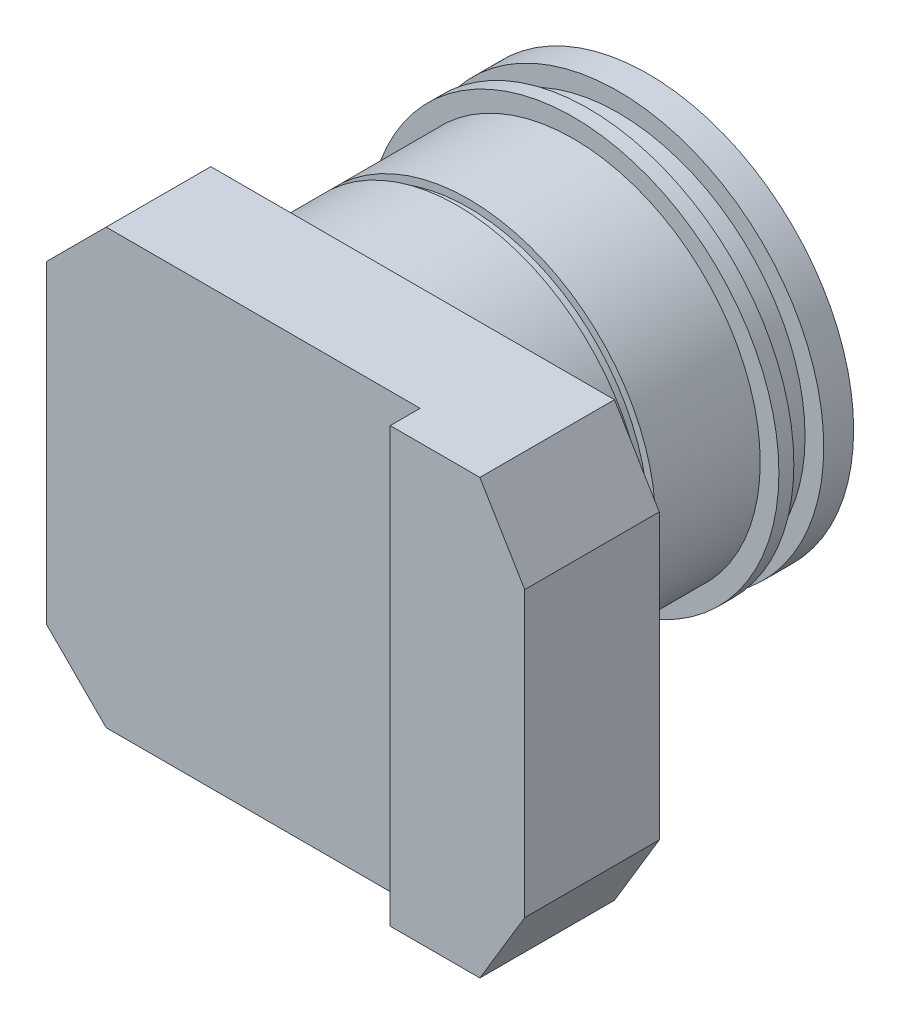
ISO-10303-21;
HEADER;
FILE_DESCRIPTION(('STEP AP214'),'2;1');
FILE_NAME('part.step','',(''),(''),'','','');
FILE_SCHEMA(('AUTOMOTIVE_DESIGN { 1 0 10303 214 1 1 1 1 }'));
ENDSEC;
DATA;
#1=APPLICATION_CONTEXT('core data for automotive mechanical design processes');
#2=APPLICATION_PROTOCOL_DEFINITION('international standard','automotive_design',2000,#1);
#3=PRODUCT_CONTEXT('',#1,'mechanical');
#4=PRODUCT('Part','Part','',(#3));
#5=PRODUCT_RELATED_PRODUCT_CATEGORY('part','',(#4));
#6=PRODUCT_DEFINITION_FORMATION('','',#4);
#7=PRODUCT_DEFINITION_CONTEXT('part definition',#1,'design');
#8=PRODUCT_DEFINITION('design','',#6,#7);
#9=PRODUCT_DEFINITION_SHAPE('','',#8);
#10=(LENGTH_UNIT() NAMED_UNIT(*) SI_UNIT(.MILLI.,.METRE.));
#11=(NAMED_UNIT(*) PLANE_ANGLE_UNIT() SI_UNIT($,.RADIAN.));
#12=(NAMED_UNIT(*) SI_UNIT($,.STERADIAN.) SOLID_ANGLE_UNIT());
#13=UNCERTAINTY_MEASURE_WITH_UNIT(LENGTH_MEASURE(1.E-05),#10,'distance_accuracy_value','');
#14=(GEOMETRIC_REPRESENTATION_CONTEXT(3) GLOBAL_UNCERTAINTY_ASSIGNED_CONTEXT((#13)) GLOBAL_UNIT_ASSIGNED_CONTEXT((#10,
#11,#12)) REPRESENTATION_CONTEXT('',''));
#15=CARTESIAN_POINT('',(0.,0.,0.));
#16=DIRECTION('',(0.,0.,1.));
#17=DIRECTION('',(1.,0.,0.));
#18=AXIS2_PLACEMENT_3D('',#15,#16,#17);
#19=CARTESIAN_POINT('',(0.,0.,3.5));
#20=DIRECTION('',(0.,0.,-1.));
#21=DIRECTION('',(-1.,0.,0.));
#22=AXIS2_PLACEMENT_3D('',#19,#20,#21);
#23=PLANE('',#22);
#24=DIRECTION('',(1.,0.,0.));
#25=VECTOR('',#24,1.);
#26=CARTESIAN_POINT('',(-17.,14.5,3.5));
#27=LINE('',#26,#25);
#28=CARTESIAN_POINT('',(-13.,14.5,3.5));
#29=VERTEX_POINT('',#28);
#30=CARTESIAN_POINT('',(8.,14.5,3.5));
#31=VERTEX_POINT('',#30);
#32=EDGE_CURVE('E148',#29,#31,#27,.T.);
#33=ORIENTED_EDGE('',*,*,#32,.F.);
#34=DIRECTION('',(-0.707106781186548,-0.707106781186548,0.));
#35=VECTOR('',#34,1.);
#36=CARTESIAN_POINT('',(-13.75,13.75,3.5));
#37=LINE('',#36,#35);
#38=CARTESIAN_POINT('',(-17.,10.5,3.5));
#39=VERTEX_POINT('',#38);
#40=EDGE_CURVE('E159',#29,#39,#37,.T.);
#41=ORIENTED_EDGE('',*,*,#40,.T.);
#42=DIRECTION('',(0.,-1.,0.));
#43=VECTOR('',#42,1.);
#44=CARTESIAN_POINT('',(-17.,14.5,3.5));
#45=LINE('',#44,#43);
#46=CARTESIAN_POINT('',(-17.,-10.5,3.5));
#47=VERTEX_POINT('',#46);
#48=EDGE_CURVE('E11',#39,#47,#45,.T.);
#49=ORIENTED_EDGE('',*,*,#48,.T.);
#50=DIRECTION('',(0.707106781186548,-0.707106781186547,0.));
#51=VECTOR('',#50,1.);
#52=CARTESIAN_POINT('',(-13.75,-13.75,3.5));
#53=LINE('',#52,#51);
#54=CARTESIAN_POINT('',(-13.,-14.5,3.5));
#55=VERTEX_POINT('',#54);
#56=EDGE_CURVE('E170',#47,#55,#53,.T.);
#57=ORIENTED_EDGE('',*,*,#56,.T.);
#58=DIRECTION('',(1.,0.,0.));
#59=VECTOR('',#58,1.);
#60=CARTESIAN_POINT('',(-17.,-14.5,3.5));
#61=LINE('',#60,#59);
#62=CARTESIAN_POINT('',(8.00000000000001,-14.5,3.5));
#63=VERTEX_POINT('',#62);
#64=EDGE_CURVE('E45',#55,#63,#61,.T.);
#65=ORIENTED_EDGE('',*,*,#64,.T.);
#66=DIRECTION('',(0.,-1.,0.));
#67=VECTOR('',#66,1.);
#68=CARTESIAN_POINT('',(8.,14.5,3.5));
#69=LINE('',#68,#67);
#70=EDGE_CURVE('E155',#31,#63,#69,.T.);
#71=ORIENTED_EDGE('',*,*,#70,.F.);
#72=EDGE_LOOP('',(#33,#41,#49,#57,#65,#71));
#73=FACE_BOUND('',#72,.T.);
#74=ADVANCED_FACE('F36',(#73),#23,.F.);
#75=CARTESIAN_POINT('',(-17.,14.5,3.5));
#76=DIRECTION('',(0.,1.,0.));
#77=DIRECTION('',(0.,0.,1.));
#78=AXIS2_PLACEMENT_3D('',#75,#76,#77);
#79=PLANE('',#78);
#80=DIRECTION('',(0.,0.,-1.));
#81=VECTOR('',#80,1.);
#82=CARTESIAN_POINT('',(14.,14.5,5.5));
#83=LINE('',#82,#81);
#84=CARTESIAN_POINT('',(14.,14.5,5.5));
#85=VERTEX_POINT('',#84);
#86=CARTESIAN_POINT('',(14.,14.5,-3.5));
#87=VERTEX_POINT('',#86);
#88=EDGE_CURVE('E183',#85,#87,#83,.T.);
#89=ORIENTED_EDGE('',*,*,#88,.T.);
#90=DIRECTION('',(1.,0.,0.));
#91=VECTOR('',#90,1.);
#92=CARTESIAN_POINT('',(-17.,14.5,-3.5));
#93=LINE('',#92,#91);
#94=CARTESIAN_POINT('',(-13.,14.5,-3.5));
#95=VERTEX_POINT('',#94);
#96=EDGE_CURVE('E141',#95,#87,#93,.T.);
#97=ORIENTED_EDGE('',*,*,#96,.F.);
#98=DIRECTION('',(0.,0.,-1.));
#99=VECTOR('',#98,1.);
#100=CARTESIAN_POINT('',(-13.,14.5,5.5));
#101=LINE('',#100,#99);
#102=EDGE_CURVE('E193',#29,#95,#101,.T.);
#103=ORIENTED_EDGE('',*,*,#102,.F.);
#104=ORIENTED_EDGE('',*,*,#32,.T.);
#105=DIRECTION('',(0.,0.,-1.));
#106=VECTOR('',#105,1.);
#107=CARTESIAN_POINT('',(8.,14.5,5.5));
#108=LINE('',#107,#106);
#109=CARTESIAN_POINT('',(8.,14.5,5.5));
#110=VERTEX_POINT('',#109);
#111=EDGE_CURVE('E145',#110,#31,#108,.T.);
#112=ORIENTED_EDGE('',*,*,#111,.F.);
#113=DIRECTION('',(-1.,0.,0.));
#114=VECTOR('',#113,1.);
#115=CARTESIAN_POINT('',(17.,14.5,5.5));
#116=LINE('',#115,#114);
#117=EDGE_CURVE('E164',#85,#110,#116,.T.);
#118=ORIENTED_EDGE('',*,*,#117,.F.);
#119=EDGE_LOOP('',(#89,#97,#103,#104,#112,#118));
#120=FACE_BOUND('',#119,.T.);
#121=ADVANCED_FACE('F38',(#120),#79,.T.);
#122=CARTESIAN_POINT('',(-17.,14.5,3.5));
#123=DIRECTION('',(1.,0.,0.));
#124=DIRECTION('',(0.,1.,0.));
#125=AXIS2_PLACEMENT_3D('',#122,#123,#124);
#126=PLANE('',#125);
#127=ORIENTED_EDGE('',*,*,#48,.F.);
#128=DIRECTION('',(0.,0.,-1.));
#129=VECTOR('',#128,1.);
#130=CARTESIAN_POINT('',(-17.,10.5,5.5));
#131=LINE('',#130,#129);
#132=CARTESIAN_POINT('',(-17.,10.5,-3.5));
#133=VERTEX_POINT('',#132);
#134=EDGE_CURVE('E126',#39,#133,#131,.T.);
#135=ORIENTED_EDGE('',*,*,#134,.T.);
#136=DIRECTION('',(0.,-1.,0.));
#137=VECTOR('',#136,1.);
#138=CARTESIAN_POINT('',(-17.,14.5,-3.5));
#139=LINE('',#138,#137);
#140=CARTESIAN_POINT('',(-17.,0.,-3.5));
#141=VERTEX_POINT('',#140);
#142=EDGE_CURVE('E40',#133,#141,#139,.T.);
#143=ORIENTED_EDGE('',*,*,#142,.T.);
#144=CARTESIAN_POINT('',(-17.,-10.5,-3.5));
#145=VERTEX_POINT('',#144);
#146=EDGE_CURVE('E58',#141,#145,#139,.T.);
#147=ORIENTED_EDGE('',*,*,#146,.T.);
#148=DIRECTION('',(0.,0.,-1.));
#149=VECTOR('',#148,1.);
#150=CARTESIAN_POINT('',(-17.,-10.5,5.5));
#151=LINE('',#150,#149);
#152=EDGE_CURVE('E123',#47,#145,#151,.T.);
#153=ORIENTED_EDGE('',*,*,#152,.F.);
#154=EDGE_LOOP('',(#127,#135,#143,#147,#153));
#155=FACE_BOUND('',#154,.T.);
#156=ADVANCED_FACE('F265',(#155),#126,.F.);
#157=CARTESIAN_POINT('',(-17.,-14.5,3.5));
#158=DIRECTION('',(0.,1.,0.));
#159=DIRECTION('',(0.,0.,1.));
#160=AXIS2_PLACEMENT_3D('',#157,#158,#159);
#161=PLANE('',#160);
#162=ORIENTED_EDGE('',*,*,#64,.F.);
#163=DIRECTION('',(0.,0.,-1.));
#164=VECTOR('',#163,1.);
#165=CARTESIAN_POINT('',(-13.,-14.5,5.5));
#166=LINE('',#165,#164);
#167=CARTESIAN_POINT('',(-13.,-14.5,-3.5));
#168=VERTEX_POINT('',#167);
#169=EDGE_CURVE('E121',#55,#168,#166,.T.);
#170=ORIENTED_EDGE('',*,*,#169,.T.);
#171=DIRECTION('',(1.,0.,0.));
#172=VECTOR('',#171,1.);
#173=CARTESIAN_POINT('',(-17.,-14.5,-3.5));
#174=LINE('',#173,#172);
#175=CARTESIAN_POINT('',(14.,-14.5,-3.5));
#176=VERTEX_POINT('',#175);
#177=EDGE_CURVE('E133',#168,#176,#174,.T.);
#178=ORIENTED_EDGE('',*,*,#177,.T.);
#179=DIRECTION('',(0.,0.,-1.));
#180=VECTOR('',#179,1.);
#181=CARTESIAN_POINT('',(14.,-14.5,5.5));
#182=LINE('',#181,#180);
#183=CARTESIAN_POINT('',(14.,-14.5,5.5));
#184=VERTEX_POINT('',#183);
#185=EDGE_CURVE('E173',#184,#176,#182,.T.);
#186=ORIENTED_EDGE('',*,*,#185,.F.);
#187=DIRECTION('',(1.,0.,0.));
#188=VECTOR('',#187,1.);
#189=CARTESIAN_POINT('',(17.,-14.5,5.5));
#190=LINE('',#189,#188);
#191=CARTESIAN_POINT('',(8.00000000000001,-14.5,5.5));
#192=VERTEX_POINT('',#191);
#193=EDGE_CURVE('E154',#192,#184,#190,.T.);
#194=ORIENTED_EDGE('',*,*,#193,.F.);
#195=DIRECTION('',(0.,0.,-1.));
#196=VECTOR('',#195,1.);
#197=CARTESIAN_POINT('',(8.00000000000001,-14.5,5.5));
#198=LINE('',#197,#196);
#199=EDGE_CURVE('E152',#192,#63,#198,.T.);
#200=ORIENTED_EDGE('',*,*,#199,.T.);
#201=EDGE_LOOP('',(#162,#170,#178,#186,#194,#200));
#202=FACE_BOUND('',#201,.T.);
#203=ADVANCED_FACE('F131',(#202),#161,.F.);
#204=CARTESIAN_POINT('',(17.,14.5,3.5));
#205=DIRECTION('',(1.,0.,0.));
#206=DIRECTION('',(0.,1.,0.));
#207=AXIS2_PLACEMENT_3D('',#204,#205,#206);
#208=PLANE('',#207);
#209=DIRECTION('',(0.,0.,-1.));
#210=VECTOR('',#209,1.);
#211=CARTESIAN_POINT('',(17.,9.5,5.5));
#212=LINE('',#211,#210);
#213=CARTESIAN_POINT('',(17.,9.5,5.5));
#214=VERTEX_POINT('',#213);
#215=CARTESIAN_POINT('',(17.,9.5,-3.5));
#216=VERTEX_POINT('',#215);
#217=EDGE_CURVE('E181',#214,#216,#212,.T.);
#218=ORIENTED_EDGE('',*,*,#217,.F.);
#219=DIRECTION('',(0.,1.,0.));
#220=VECTOR('',#219,1.);
#221=CARTESIAN_POINT('',(17.,14.5,5.5));
#222=LINE('',#221,#220);
#223=CARTESIAN_POINT('',(17.,-9.49999999999998,5.5));
#224=VERTEX_POINT('',#223);
#225=EDGE_CURVE('E158',#224,#214,#222,.T.);
#226=ORIENTED_EDGE('',*,*,#225,.F.);
#227=DIRECTION('',(0.,0.,-1.));
#228=VECTOR('',#227,1.);
#229=CARTESIAN_POINT('',(17.,-9.5,5.5));
#230=LINE('',#229,#228);
#231=CARTESIAN_POINT('',(17.,-9.5,-3.5));
#232=VERTEX_POINT('',#231);
#233=EDGE_CURVE('E172',#224,#232,#230,.T.);
#234=ORIENTED_EDGE('',*,*,#233,.T.);
#235=DIRECTION('',(0.,-1.,0.));
#236=VECTOR('',#235,1.);
#237=CARTESIAN_POINT('',(17.,14.5,-3.5));
#238=LINE('',#237,#236);
#239=EDGE_CURVE('E140',#216,#232,#238,.T.);
#240=ORIENTED_EDGE('',*,*,#239,.F.);
#241=EDGE_LOOP('',(#218,#226,#234,#240));
#242=FACE_BOUND('',#241,.T.);
#243=ADVANCED_FACE('F274',(#242),#208,.T.);
#244=CARTESIAN_POINT('',(0.,0.,-3.5));
#245=DIRECTION('',(0.,0.,-1.));
#246=DIRECTION('',(-1.,0.,0.));
#247=AXIS2_PLACEMENT_3D('',#244,#245,#246);
#248=PLANE('',#247);
#249=ORIENTED_EDGE('',*,*,#146,.F.);
#250=CARTESIAN_POINT('',(-4.5,0.,-3.5));
#251=DIRECTION('',(0.,0.,1.));
#252=DIRECTION('',(1.,0.,0.));
#253=AXIS2_PLACEMENT_3D('',#250,#251,#252);
#254=CIRCLE('',#253,12.5);
#255=EDGE_CURVE('E51',#141,#141,#254,.T.);
#256=ORIENTED_EDGE('',*,*,#255,.T.);
#257=ORIENTED_EDGE('',*,*,#142,.F.);
#258=DIRECTION('',(-0.707106781186548,-0.707106781186548,0.));
#259=VECTOR('',#258,1.);
#260=CARTESIAN_POINT('',(-17.,10.5,-3.5));
#261=LINE('',#260,#259);
#262=EDGE_CURVE('E187',#95,#133,#261,.T.);
#263=ORIENTED_EDGE('',*,*,#262,.F.);
#264=ORIENTED_EDGE('',*,*,#96,.T.);
#265=DIRECTION('',(-0.514495755427526,0.857492925712544,0.));
#266=VECTOR('',#265,1.);
#267=CARTESIAN_POINT('',(17.,9.5,-3.5));
#268=LINE('',#267,#266);
#269=EDGE_CURVE('E188',#216,#87,#268,.T.);
#270=ORIENTED_EDGE('',*,*,#269,.F.);
#271=ORIENTED_EDGE('',*,*,#239,.T.);
#272=DIRECTION('',(0.514495755427525,0.857492925712545,0.));
#273=VECTOR('',#272,1.);
#274=CARTESIAN_POINT('',(14.,-14.5,-3.5));
#275=LINE('',#274,#273);
#276=EDGE_CURVE('E135',#176,#232,#275,.T.);
#277=ORIENTED_EDGE('',*,*,#276,.F.);
#278=ORIENTED_EDGE('',*,*,#177,.F.);
#279=DIRECTION('',(0.707106781186548,-0.707106781186547,0.));
#280=VECTOR('',#279,1.);
#281=CARTESIAN_POINT('',(-13.,-14.5,-3.5));
#282=LINE('',#281,#280);
#283=EDGE_CURVE('E118',#145,#168,#282,.T.);
#284=ORIENTED_EDGE('',*,*,#283,.F.);
#285=EDGE_LOOP('',(#249,#256,#257,#263,#264,#270,#271,#277,#278,#284));
#286=FACE_BOUND('',#285,.T.);
#287=ADVANCED_FACE('F138',(#286),#248,.T.);
#288=CARTESIAN_POINT('',(8.,14.5,5.5));
#289=DIRECTION('',(1.,0.,0.));
#290=DIRECTION('',(0.,1.,0.));
#291=AXIS2_PLACEMENT_3D('',#288,#289,#290);
#292=PLANE('',#291);
#293=ORIENTED_EDGE('',*,*,#70,.T.);
#294=ORIENTED_EDGE('',*,*,#199,.F.);
#295=DIRECTION('',(0.,-1.,0.));
#296=VECTOR('',#295,1.);
#297=CARTESIAN_POINT('',(8.,14.5,5.5));
#298=LINE('',#297,#296);
#299=EDGE_CURVE('E162',#110,#192,#298,.T.);
#300=ORIENTED_EDGE('',*,*,#299,.F.);
#301=ORIENTED_EDGE('',*,*,#111,.T.);
#302=EDGE_LOOP('',(#293,#294,#300,#301));
#303=FACE_BOUND('',#302,.T.);
#304=ADVANCED_FACE('F270',(#303),#292,.F.);
#305=CARTESIAN_POINT('',(0.,0.,5.5));
#306=DIRECTION('',(0.,0.,-1.));
#307=DIRECTION('',(-1.,0.,0.));
#308=AXIS2_PLACEMENT_3D('',#305,#306,#307);
#309=PLANE('',#308);
#310=ORIENTED_EDGE('',*,*,#225,.T.);
#311=DIRECTION('',(-0.514495755427526,0.857492925712544,0.));
#312=VECTOR('',#311,1.);
#313=CARTESIAN_POINT('',(17.,9.5,5.5));
#314=LINE('',#313,#312);
#315=EDGE_CURVE('E184',#214,#85,#314,.T.);
#316=ORIENTED_EDGE('',*,*,#315,.T.);
#317=ORIENTED_EDGE('',*,*,#117,.T.);
#318=ORIENTED_EDGE('',*,*,#299,.T.);
#319=ORIENTED_EDGE('',*,*,#193,.T.);
#320=DIRECTION('',(0.514495755427525,0.857492925712545,0.));
#321=VECTOR('',#320,1.);
#322=CARTESIAN_POINT('',(14.,-14.5,5.5));
#323=LINE('',#322,#321);
#324=EDGE_CURVE('E175',#184,#224,#323,.T.);
#325=ORIENTED_EDGE('',*,*,#324,.T.);
#326=EDGE_LOOP('',(#310,#316,#317,#318,#319,#325));
#327=FACE_BOUND('',#326,.T.);
#328=ADVANCED_FACE('F288',(#327),#309,.F.);
#329=CARTESIAN_POINT('',(14.,-14.5,5.5));
#330=DIRECTION('',(-0.857492925712545,0.514495755427525,0.));
#331=DIRECTION('',(-0.514495755427526,-0.857492925712545,0.));
#332=AXIS2_PLACEMENT_3D('',#329,#330,#331);
#333=PLANE('',#332);
#334=ORIENTED_EDGE('',*,*,#276,.T.);
#335=ORIENTED_EDGE('',*,*,#233,.F.);
#336=ORIENTED_EDGE('',*,*,#324,.F.);
#337=ORIENTED_EDGE('',*,*,#185,.T.);
#338=EDGE_LOOP('',(#334,#335,#336,#337));
#339=FACE_BOUND('',#338,.T.);
#340=ADVANCED_FACE('F292',(#339),#333,.F.);
#341=CARTESIAN_POINT('',(17.,9.5,5.5));
#342=DIRECTION('',(-0.857492925712544,-0.514495755427526,0.));
#343=DIRECTION('',(0.514495755427526,-0.857492925712544,0.));
#344=AXIS2_PLACEMENT_3D('',#341,#342,#343);
#345=PLANE('',#344);
#346=ORIENTED_EDGE('',*,*,#269,.T.);
#347=ORIENTED_EDGE('',*,*,#88,.F.);
#348=ORIENTED_EDGE('',*,*,#315,.F.);
#349=ORIENTED_EDGE('',*,*,#217,.T.);
#350=EDGE_LOOP('',(#346,#347,#348,#349));
#351=FACE_BOUND('',#350,.T.);
#352=ADVANCED_FACE('F304',(#351),#345,.F.);
#353=CARTESIAN_POINT('',(-13.,-14.5,5.5));
#354=DIRECTION('',(0.707106781186547,0.707106781186548,0.));
#355=DIRECTION('',(-0.707106781186548,0.707106781186547,0.));
#356=AXIS2_PLACEMENT_3D('',#353,#354,#355);
#357=PLANE('',#356);
#358=ORIENTED_EDGE('',*,*,#152,.T.);
#359=ORIENTED_EDGE('',*,*,#283,.T.);
#360=ORIENTED_EDGE('',*,*,#169,.F.);
#361=ORIENTED_EDGE('',*,*,#56,.F.);
#362=EDGE_LOOP('',(#358,#359,#360,#361));
#363=FACE_BOUND('',#362,.T.);
#364=ADVANCED_FACE('F120',(#363),#357,.F.);
#365=CARTESIAN_POINT('',(-17.,10.5,5.5));
#366=DIRECTION('',(0.707106781186547,-0.707106781186547,0.));
#367=DIRECTION('',(0.707106781186548,0.707106781186548,0.));
#368=AXIS2_PLACEMENT_3D('',#365,#366,#367);
#369=PLANE('',#368);
#370=ORIENTED_EDGE('',*,*,#102,.T.);
#371=ORIENTED_EDGE('',*,*,#262,.T.);
#372=ORIENTED_EDGE('',*,*,#134,.F.);
#373=ORIENTED_EDGE('',*,*,#40,.F.);
#374=EDGE_LOOP('',(#370,#371,#372,#373));
#375=FACE_BOUND('',#374,.T.);
#376=ADVANCED_FACE('F311',(#375),#369,.F.);
#377=CARTESIAN_POINT('',(-4.5,0.,-3.5));
#378=DIRECTION('',(0.,0.,1.));
#379=DIRECTION('',(1.,0.,0.));
#380=AXIS2_PLACEMENT_3D('',#377,#378,#379);
#381=CYLINDRICAL_SURFACE('',#380,12.5);
#382=ORIENTED_EDGE('',*,*,#255,.F.);
#383=EDGE_LOOP('',(#382));
#384=FACE_BOUND('',#383,.T.);
#385=CARTESIAN_POINT('',(-4.5,0.,-11.5));
#386=DIRECTION('',(0.,0.,1.));
#387=DIRECTION('',(1.,0.,0.));
#388=AXIS2_PLACEMENT_3D('',#385,#386,#387);
#389=CIRCLE('',#388,12.5);
#390=CARTESIAN_POINT('',(8.,0.,-11.5));
#391=VERTEX_POINT('',#390);
#392=EDGE_CURVE('E190',#391,#391,#389,.T.);
#393=ORIENTED_EDGE('',*,*,#392,.T.);
#394=EDGE_LOOP('',(#393));
#395=FACE_BOUND('',#394,.T.);
#396=ADVANCED_FACE('F336',(#384,#395),#381,.T.);
#397=CARTESIAN_POINT('',(-17.,0.,-11.5));
#398=DIRECTION('',(0.,0.,1.));
#399=DIRECTION('',(1.,0.,0.));
#400=AXIS2_PLACEMENT_3D('',#397,#398,#399);
#401=PLANE('',#400);
#402=ORIENTED_EDGE('',*,*,#392,.F.);
#403=EDGE_LOOP('',(#402));
#404=FACE_BOUND('',#403,.T.);
#405=CARTESIAN_POINT('',(-4.5,0.,-11.5));
#406=DIRECTION('',(0.,0.,1.));
#407=DIRECTION('',(1.,0.,0.));
#408=AXIS2_PLACEMENT_3D('',#405,#406,#407);
#409=CIRCLE('',#408,12.);
#410=CARTESIAN_POINT('',(7.5,0.,-11.5));
#411=VERTEX_POINT('',#410);
#412=EDGE_CURVE('E201',#411,#411,#409,.T.);
#413=ORIENTED_EDGE('',*,*,#412,.T.);
#414=EDGE_LOOP('',(#413));
#415=FACE_BOUND('',#414,.T.);
#416=ADVANCED_FACE('F341',(#404,#415),#401,.F.);
#417=CARTESIAN_POINT('',(-4.5,0.,-3.5));
#418=DIRECTION('',(0.,0.,1.));
#419=DIRECTION('',(1.,0.,0.));
#420=AXIS2_PLACEMENT_3D('',#417,#418,#419);
#421=CYLINDRICAL_SURFACE('',#420,12.);
#422=ORIENTED_EDGE('',*,*,#412,.F.);
#423=EDGE_LOOP('',(#422));
#424=FACE_BOUND('',#423,.T.);
#425=CARTESIAN_POINT('',(-4.5,0.,-12.25));
#426=DIRECTION('',(0.,0.,1.));
#427=DIRECTION('',(1.,0.,0.));
#428=AXIS2_PLACEMENT_3D('',#425,#426,#427);
#429=CIRCLE('',#428,12.);
#430=CARTESIAN_POINT('',(7.5,0.,-12.25));
#431=VERTEX_POINT('',#430);
#432=EDGE_CURVE('E204',#431,#431,#429,.T.);
#433=ORIENTED_EDGE('',*,*,#432,.T.);
#434=EDGE_LOOP('',(#433));
#435=FACE_BOUND('',#434,.T.);
#436=ADVANCED_FACE('F352',(#424,#435),#421,.T.);
#437=CARTESIAN_POINT('',(-16.5,0.,-12.25));
#438=DIRECTION('',(0.,0.,-1.));
#439=DIRECTION('',(-1.,0.,0.));
#440=AXIS2_PLACEMENT_3D('',#437,#438,#439);
#441=PLANE('',#440);
#442=ORIENTED_EDGE('',*,*,#432,.F.);
#443=EDGE_LOOP('',(#442));
#444=FACE_BOUND('',#443,.T.);
#445=CARTESIAN_POINT('',(-4.5,0.,-12.25));
#446=DIRECTION('',(0.,0.,1.));
#447=DIRECTION('',(1.,0.,0.));
#448=AXIS2_PLACEMENT_3D('',#445,#446,#447);
#449=CIRCLE('',#448,12.5);
#450=CARTESIAN_POINT('',(8.,0.,-12.25));
#451=VERTEX_POINT('',#450);
#452=EDGE_CURVE('E207',#451,#451,#449,.T.);
#453=ORIENTED_EDGE('',*,*,#452,.T.);
#454=EDGE_LOOP('',(#453));
#455=FACE_BOUND('',#454,.T.);
#456=ADVANCED_FACE('F362',(#444,#455),#441,.F.);
#457=CARTESIAN_POINT('',(-4.5,0.,-3.5));
#458=DIRECTION('',(0.,0.,1.));
#459=DIRECTION('',(1.,0.,0.));
#460=AXIS2_PLACEMENT_3D('',#457,#458,#459);
#461=CYLINDRICAL_SURFACE('',#460,12.5);
#462=ORIENTED_EDGE('',*,*,#452,.F.);
#463=EDGE_LOOP('',(#462));
#464=FACE_BOUND('',#463,.T.);
#465=CARTESIAN_POINT('',(-4.5,0.,-19.25));
#466=DIRECTION('',(0.,0.,1.));
#467=DIRECTION('',(1.,0.,0.));
#468=AXIS2_PLACEMENT_3D('',#465,#466,#467);
#469=CIRCLE('',#468,12.5);
#470=CARTESIAN_POINT('',(8.,0.,-19.25));
#471=VERTEX_POINT('',#470);
#472=EDGE_CURVE('E210',#471,#471,#469,.T.);
#473=ORIENTED_EDGE('',*,*,#472,.T.);
#474=EDGE_LOOP('',(#473));
#475=FACE_BOUND('',#474,.T.);
#476=ADVANCED_FACE('F372',(#464,#475),#461,.T.);
#477=CARTESIAN_POINT('',(-17.,0.,-19.25));
#478=DIRECTION('',(0.,0.,-1.));
#479=DIRECTION('',(-1.,0.,0.));
#480=AXIS2_PLACEMENT_3D('',#477,#478,#479);
#481=PLANE('',#480);
#482=ORIENTED_EDGE('',*,*,#472,.F.);
#483=EDGE_LOOP('',(#482));
#484=FACE_BOUND('',#483,.T.);
#485=CARTESIAN_POINT('',(-4.5,0.,-19.25));
#486=DIRECTION('',(0.,0.,1.));
#487=DIRECTION('',(1.,0.,0.));
#488=AXIS2_PLACEMENT_3D('',#485,#486,#487);
#489=CIRCLE('',#488,13.75);
#490=CARTESIAN_POINT('',(9.25,0.,-19.25));
#491=VERTEX_POINT('',#490);
#492=EDGE_CURVE('E213',#491,#491,#489,.T.);
#493=ORIENTED_EDGE('',*,*,#492,.T.);
#494=EDGE_LOOP('',(#493));
#495=FACE_BOUND('',#494,.T.);
#496=ADVANCED_FACE('F382',(#484,#495),#481,.F.);
#497=CARTESIAN_POINT('',(-4.5,0.,-3.5));
#498=DIRECTION('',(0.,0.,1.));
#499=DIRECTION('',(1.,0.,0.));
#500=AXIS2_PLACEMENT_3D('',#497,#498,#499);
#501=CYLINDRICAL_SURFACE('',#500,13.75);
#502=ORIENTED_EDGE('',*,*,#492,.F.);
#503=EDGE_LOOP('',(#502));
#504=FACE_BOUND('',#503,.T.);
#505=CARTESIAN_POINT('',(-4.5,0.,-20.25));
#506=DIRECTION('',(0.,0.,1.));
#507=DIRECTION('',(1.,0.,0.));
#508=AXIS2_PLACEMENT_3D('',#505,#506,#507);
#509=CIRCLE('',#508,13.75);
#510=CARTESIAN_POINT('',(9.25,0.,-20.25));
#511=VERTEX_POINT('',#510);
#512=EDGE_CURVE('E216',#511,#511,#509,.T.);
#513=ORIENTED_EDGE('',*,*,#512,.T.);
#514=EDGE_LOOP('',(#513));
#515=FACE_BOUND('',#514,.T.);
#516=ADVANCED_FACE('F392',(#504,#515),#501,.T.);
#517=CARTESIAN_POINT('',(-18.25,0.,-20.25));
#518=DIRECTION('',(0.,0.,1.));
#519=DIRECTION('',(1.,0.,0.));
#520=AXIS2_PLACEMENT_3D('',#517,#518,#519);
#521=PLANE('',#520);
#522=ORIENTED_EDGE('',*,*,#512,.F.);
#523=EDGE_LOOP('',(#522));
#524=FACE_BOUND('',#523,.T.);
#525=CARTESIAN_POINT('',(-4.5,0.,-20.25));
#526=DIRECTION('',(0.,0.,1.));
#527=DIRECTION('',(1.,0.,0.));
#528=AXIS2_PLACEMENT_3D('',#525,#526,#527);
#529=CIRCLE('',#528,12.5);
#530=CARTESIAN_POINT('',(8.,0.,-20.25));
#531=VERTEX_POINT('',#530);
#532=EDGE_CURVE('E219',#531,#531,#529,.T.);
#533=ORIENTED_EDGE('',*,*,#532,.T.);
#534=EDGE_LOOP('',(#533));
#535=FACE_BOUND('',#534,.T.);
#536=ADVANCED_FACE('F402',(#524,#535),#521,.F.);
#537=CARTESIAN_POINT('',(-4.5,0.,-3.5));
#538=DIRECTION('',(0.,0.,1.));
#539=DIRECTION('',(1.,0.,0.));
#540=AXIS2_PLACEMENT_3D('',#537,#538,#539);
#541=CYLINDRICAL_SURFACE('',#540,12.5);
#542=ORIENTED_EDGE('',*,*,#532,.F.);
#543=EDGE_LOOP('',(#542));
#544=FACE_BOUND('',#543,.T.);
#545=CARTESIAN_POINT('',(-4.5,0.,-22.25));
#546=DIRECTION('',(0.,0.,1.));
#547=DIRECTION('',(1.,0.,0.));
#548=AXIS2_PLACEMENT_3D('',#545,#546,#547);
#549=CIRCLE('',#548,12.5);
#550=CARTESIAN_POINT('',(8.,0.,-22.25));
#551=VERTEX_POINT('',#550);
#552=EDGE_CURVE('E222',#551,#551,#549,.T.);
#553=ORIENTED_EDGE('',*,*,#552,.T.);
#554=EDGE_LOOP('',(#553));
#555=FACE_BOUND('',#554,.T.);
#556=ADVANCED_FACE('F255',(#544,#555),#541,.T.);
#557=CARTESIAN_POINT('',(-17.,0.,-22.25));
#558=DIRECTION('',(0.,0.,-1.));
#559=DIRECTION('',(-1.,0.,0.));
#560=AXIS2_PLACEMENT_3D('',#557,#558,#559);
#561=PLANE('',#560);
#562=ORIENTED_EDGE('',*,*,#552,.F.);
#563=EDGE_LOOP('',(#562));
#564=FACE_BOUND('',#563,.T.);
#565=CARTESIAN_POINT('',(-4.5,0.,-22.25));
#566=DIRECTION('',(0.,0.,1.));
#567=DIRECTION('',(1.,0.,0.));
#568=AXIS2_PLACEMENT_3D('',#565,#566,#567);
#569=CIRCLE('',#568,13.75);
#570=CARTESIAN_POINT('',(9.25,0.,-22.25));
#571=VERTEX_POINT('',#570);
#572=EDGE_CURVE('E225',#571,#571,#569,.T.);
#573=ORIENTED_EDGE('',*,*,#572,.T.);
#574=EDGE_LOOP('',(#573));
#575=FACE_BOUND('',#574,.T.);
#576=ADVANCED_FACE('F249',(#564,#575),#561,.F.);
#577=CARTESIAN_POINT('',(-4.5,0.,-3.5));
#578=DIRECTION('',(0.,0.,1.));
#579=DIRECTION('',(1.,0.,0.));
#580=AXIS2_PLACEMENT_3D('',#577,#578,#579);
#581=CYLINDRICAL_SURFACE('',#580,13.75);
#582=ORIENTED_EDGE('',*,*,#572,.F.);
#583=EDGE_LOOP('',(#582));
#584=FACE_BOUND('',#583,.T.);
#585=CARTESIAN_POINT('',(-4.5,0.,-24.25));
#586=DIRECTION('',(0.,0.,1.));
#587=DIRECTION('',(1.,0.,0.));
#588=AXIS2_PLACEMENT_3D('',#585,#586,#587);
#589=CIRCLE('',#588,13.75);
#590=CARTESIAN_POINT('',(9.25,0.,-24.25));
#591=VERTEX_POINT('',#590);
#592=EDGE_CURVE('E228',#591,#591,#589,.T.);
#593=ORIENTED_EDGE('',*,*,#592,.T.);
#594=EDGE_LOOP('',(#593));
#595=FACE_BOUND('',#594,.T.);
#596=ADVANCED_FACE('F244',(#584,#595),#581,.T.);
#597=CARTESIAN_POINT('',(-18.25,0.,-24.25));
#598=DIRECTION('',(0.,0.,1.));
#599=DIRECTION('',(1.,0.,0.));
#600=AXIS2_PLACEMENT_3D('',#597,#598,#599);
#601=PLANE('',#600);
#602=CARTESIAN_POINT('',(-4.5,0.,-24.25));
#603=DIRECTION('',(0.,0.,-1.));
#604=DIRECTION('',(-1.,0.,0.));
#605=AXIS2_PLACEMENT_3D('',#602,#603,#604);
#606=CIRCLE('',#605,9.75);
#607=CARTESIAN_POINT('',(-14.25,0.,-24.25));
#608=VERTEX_POINT('',#607);
#609=EDGE_CURVE('E235',#608,#608,#606,.T.);
#610=ORIENTED_EDGE('',*,*,#609,.F.);
#611=EDGE_LOOP('',(#610));
#612=FACE_BOUND('',#611,.T.);
#613=ORIENTED_EDGE('',*,*,#592,.F.);
#614=EDGE_LOOP('',(#613));
#615=FACE_BOUND('',#614,.T.);
#616=ADVANCED_FACE('F241',(#612,#615),#601,.F.);
#617=CARTESIAN_POINT('',(-4.5,0.,-24.25));
#618=DIRECTION('',(0.,0.,-1.));
#619=DIRECTION('',(-1.,0.,0.));
#620=AXIS2_PLACEMENT_3D('',#617,#618,#619);
#621=CONICAL_SURFACE('',#620,9.75,0.78539816339745);
#622=CARTESIAN_POINT('',(-4.5,0.,-19.25));
#623=DIRECTION('',(0.,0.,-1.));
#624=DIRECTION('',(-1.,0.,0.));
#625=AXIS2_PLACEMENT_3D('',#622,#623,#624);
#626=CIRCLE('',#625,4.74999999999998);
#627=CARTESIAN_POINT('',(-9.24999999999998,0.,-19.25));
#628=VERTEX_POINT('',#627);
#629=EDGE_CURVE('E232',#628,#628,#626,.T.);
#630=ORIENTED_EDGE('',*,*,#629,.F.);
#631=EDGE_LOOP('',(#630));
#632=FACE_BOUND('',#631,.T.);
#633=ORIENTED_EDGE('',*,*,#609,.T.);
#634=EDGE_LOOP('',(#633));
#635=FACE_BOUND('',#634,.T.);
#636=ADVANCED_FACE('F239',(#632,#635),#621,.F.);
#637=CARTESIAN_POINT('',(-4.5,0.,-19.25));
#638=DIRECTION('',(0.,0.,1.));
#639=DIRECTION('',(-1.,0.,0.));
#640=AXIS2_PLACEMENT_3D('',#637,#638,#639);
#641=SPHERICAL_SURFACE('',#640,4.74999999999999);
#642=ORIENTED_EDGE('',*,*,#629,.T.);
#643=EDGE_LOOP('',(#642));
#644=FACE_BOUND('',#643,.T.);
#645=ADVANCED_FACE('F446',(#644),#641,.T.);
#646=CLOSED_SHELL('',(#74,#121,#156,#203,#243,#287,#304,#328,#340,#352,#364,#376,#396,#416,#436,
#456,#476,#496,#516,#536,#556,#576,#596,#616,#636,#645));
#647=MANIFOLD_SOLID_BREP('B2',#646);
#648=ADVANCED_BREP_SHAPE_REPRESENTATION('',(#18,#647),#14);
#649=SHAPE_DEFINITION_REPRESENTATION(#9,#648);
ENDSEC;
END-ISO-10303-21;
